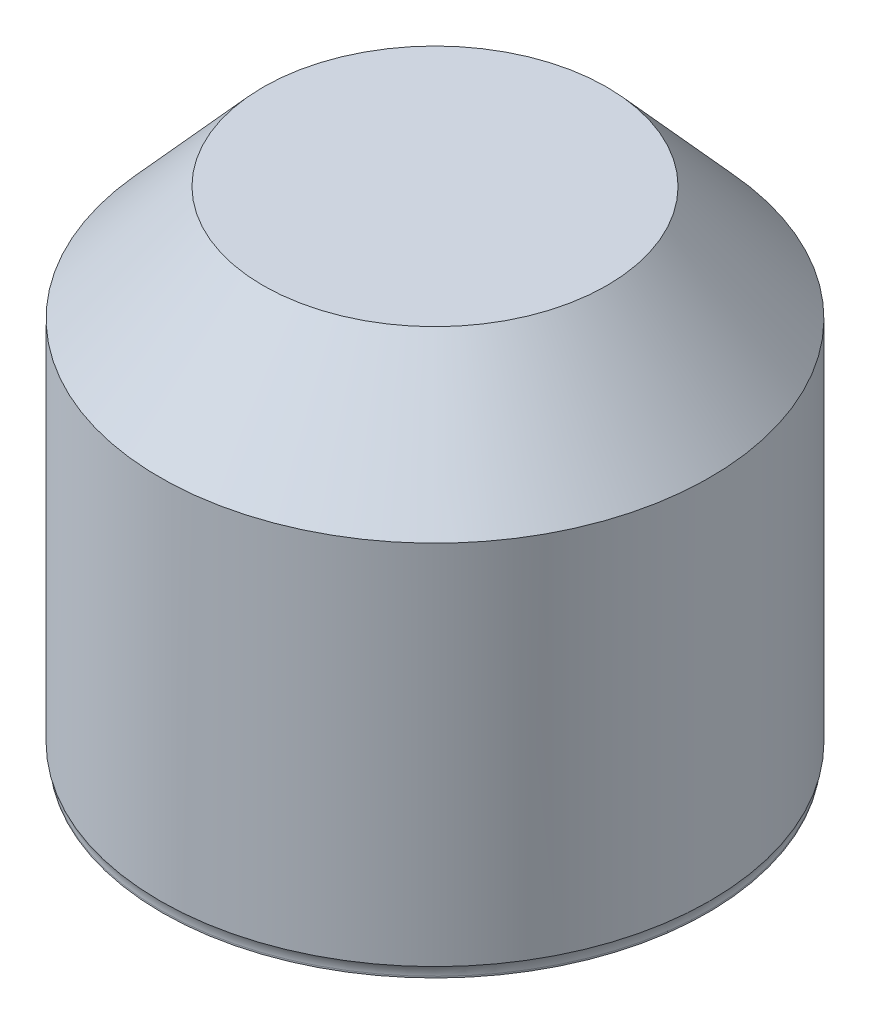
ISO-10303-21;
HEADER;
FILE_DESCRIPTION(('STEP AP214'),'2;1');
FILE_NAME('part.step','',(''),(''),'','','');
FILE_SCHEMA(('AUTOMOTIVE_DESIGN { 1 0 10303 214 1 1 1 1 }'));
ENDSEC;
DATA;
#1=APPLICATION_CONTEXT('core data for automotive mechanical design processes');
#2=APPLICATION_PROTOCOL_DEFINITION('international standard','automotive_design',2000,#1);
#3=PRODUCT_CONTEXT('',#1,'mechanical');
#4=PRODUCT('Part','Part','',(#3));
#5=PRODUCT_RELATED_PRODUCT_CATEGORY('part','',(#4));
#6=PRODUCT_DEFINITION_FORMATION('','',#4);
#7=PRODUCT_DEFINITION_CONTEXT('part definition',#1,'design');
#8=PRODUCT_DEFINITION('design','',#6,#7);
#9=PRODUCT_DEFINITION_SHAPE('','',#8);
#10=(LENGTH_UNIT() NAMED_UNIT(*) SI_UNIT(.MILLI.,.METRE.));
#11=(NAMED_UNIT(*) PLANE_ANGLE_UNIT() SI_UNIT($,.RADIAN.));
#12=(NAMED_UNIT(*) SI_UNIT($,.STERADIAN.) SOLID_ANGLE_UNIT());
#13=UNCERTAINTY_MEASURE_WITH_UNIT(LENGTH_MEASURE(1.E-05),#10,'distance_accuracy_value','');
#14=(GEOMETRIC_REPRESENTATION_CONTEXT(3) GLOBAL_UNCERTAINTY_ASSIGNED_CONTEXT((#13)) GLOBAL_UNIT_ASSIGNED_CONTEXT((#10,
#11,#12)) REPRESENTATION_CONTEXT('',''));
#15=CARTESIAN_POINT('',(0.,0.,0.));
#16=DIRECTION('',(0.,0.,1.));
#17=DIRECTION('',(1.,0.,0.));
#18=AXIS2_PLACEMENT_3D('',#15,#16,#17);
#19=CARTESIAN_POINT('',(0.,0.,0.));
#20=DIRECTION('',(0.,1.,0.));
#21=DIRECTION('',(0.,0.,1.));
#22=AXIS2_PLACEMENT_3D('',#19,#20,#21);
#23=PLANE('',#22);
#24=CARTESIAN_POINT('',(0.,0.,0.));
#25=DIRECTION('',(0.,1.,0.));
#26=DIRECTION('',(0.,0.,1.));
#27=AXIS2_PLACEMENT_3D('',#24,#25,#26);
#28=CIRCLE('',#27,59.5);
#29=CARTESIAN_POINT('',(0.,0.,59.5));
#30=VERTEX_POINT('',#29);
#31=EDGE_CURVE('E71',#30,#30,#28,.T.);
#32=ORIENTED_EDGE('',*,*,#31,.F.);
#33=EDGE_LOOP('',(#32));
#34=FACE_BOUND('',#33,.T.);
#35=CARTESIAN_POINT('',(0.,0.,0.));
#36=DIRECTION('',(0.,1.,0.));
#37=DIRECTION('',(0.,0.,1.));
#38=AXIS2_PLACEMENT_3D('',#35,#36,#37);
#39=CIRCLE('',#38,52.);
#40=CARTESIAN_POINT('',(0.,0.,52.));
#41=VERTEX_POINT('',#40);
#42=EDGE_CURVE('E74',#41,#41,#39,.T.);
#43=ORIENTED_EDGE('',*,*,#42,.T.);
#44=EDGE_LOOP('',(#43));
#45=FACE_BOUND('',#44,.T.);
#46=ADVANCED_FACE('F41',(#34,#45),#23,.F.);
#47=CARTESIAN_POINT('',(0.,2.5,0.));
#48=DIRECTION('',(0.,-1.,0.));
#49=DIRECTION('',(0.,0.,-1.));
#50=AXIS2_PLACEMENT_3D('',#47,#48,#49);
#51=CYLINDRICAL_SURFACE('',#50,59.5);
#52=CARTESIAN_POINT('',(0.,0.320550528229659,0.));
#53=DIRECTION('',(0.,1.,0.));
#54=DIRECTION('',(0.,0.,1.));
#55=AXIS2_PLACEMENT_3D('',#52,#53,#54);
#56=CIRCLE('',#55,59.5);
#57=CARTESIAN_POINT('',(0.,0.320550528229659,59.5));
#58=VERTEX_POINT('',#57);
#59=EDGE_CURVE('E11',#58,#58,#56,.F.);
#60=ORIENTED_EDGE('',*,*,#59,.T.);
#61=EDGE_LOOP('',(#60));
#62=FACE_BOUND('',#61,.T.);
#63=ORIENTED_EDGE('',*,*,#31,.T.);
#64=EDGE_LOOP('',(#63));
#65=FACE_BOUND('',#64,.T.);
#66=ADVANCED_FACE('F136',(#62,#65),#51,.T.);
#67=CARTESIAN_POINT('',(0.,2.5,0.));
#68=DIRECTION('',(0.,-1.,0.));
#69=DIRECTION('',(0.,0.,-1.));
#70=AXIS2_PLACEMENT_3D('',#67,#68,#69);
#71=CYLINDRICAL_SURFACE('',#70,52.);
#72=CARTESIAN_POINT('',(0.,2.5,0.));
#73=DIRECTION('',(0.,1.,0.));
#74=DIRECTION('',(0.,0.,1.));
#75=AXIS2_PLACEMENT_3D('',#72,#73,#74);
#76=CIRCLE('',#75,52.);
#77=CARTESIAN_POINT('',(0.,2.5,52.));
#78=VERTEX_POINT('',#77);
#79=EDGE_CURVE('E77',#78,#78,#76,.T.);
#80=ORIENTED_EDGE('',*,*,#79,.T.);
#81=EDGE_LOOP('',(#80));
#82=FACE_BOUND('',#81,.T.);
#83=ORIENTED_EDGE('',*,*,#42,.F.);
#84=EDGE_LOOP('',(#83));
#85=FACE_BOUND('',#84,.T.);
#86=ADVANCED_FACE('F129',(#82,#85),#71,.F.);
#87=CARTESIAN_POINT('',(0.,2.5,0.));
#88=DIRECTION('',(0.,1.,0.));
#89=DIRECTION('',(0.,0.,1.));
#90=AXIS2_PLACEMENT_3D('',#87,#88,#89);
#91=PLANE('',#90);
#92=CARTESIAN_POINT('',(0.,2.5,0.));
#93=DIRECTION('',(0.,1.,0.));
#94=DIRECTION('',(0.,0.,1.));
#95=AXIS2_PLACEMENT_3D('',#92,#93,#94);
#96=CIRCLE('',#95,47.365);
#97=CARTESIAN_POINT('',(0.,2.5,47.365));
#98=VERTEX_POINT('',#97);
#99=EDGE_CURVE('E68',#98,#98,#96,.T.);
#100=ORIENTED_EDGE('',*,*,#99,.T.);
#101=EDGE_LOOP('',(#100));
#102=FACE_BOUND('',#101,.T.);
#103=ORIENTED_EDGE('',*,*,#79,.F.);
#104=EDGE_LOOP('',(#103));
#105=FACE_BOUND('',#104,.T.);
#106=ADVANCED_FACE('F126',(#102,#105),#91,.F.);
#107=CARTESIAN_POINT('',(0.,72.5,0.));
#108=DIRECTION('',(0.,-1.,0.));
#109=DIRECTION('',(0.,0.,-1.));
#110=AXIS2_PLACEMENT_3D('',#107,#108,#109);
#111=CYLINDRICAL_SURFACE('',#110,60.);
#112=CARTESIAN_POINT('',(0.,2.5,0.));
#113=DIRECTION('',(0.,1.,0.));
#114=DIRECTION('',(0.,0.,1.));
#115=AXIS2_PLACEMENT_3D('',#112,#113,#114);
#116=CIRCLE('',#115,60.);
#117=CARTESIAN_POINT('',(0.,2.5,60.));
#118=VERTEX_POINT('',#117);
#119=EDGE_CURVE('E64',#118,#118,#116,.T.);
#120=ORIENTED_EDGE('',*,*,#119,.T.);
#121=EDGE_LOOP('',(#120));
#122=FACE_BOUND('',#121,.T.);
#123=CARTESIAN_POINT('',(0.,82.5,0.));
#124=DIRECTION('',(0.,-1.,0.));
#125=DIRECTION('',(0.,0.,-1.));
#126=AXIS2_PLACEMENT_3D('',#123,#124,#125);
#127=CIRCLE('',#126,60.);
#128=CARTESIAN_POINT('',(0.,82.5,-60.));
#129=VERTEX_POINT('',#128);
#130=EDGE_CURVE('E61',#129,#129,#127,.F.);
#131=ORIENTED_EDGE('',*,*,#130,.F.);
#132=EDGE_LOOP('',(#131));
#133=FACE_BOUND('',#132,.T.);
#134=ADVANCED_FACE('F124',(#122,#133),#111,.T.);
#135=CARTESIAN_POINT('',(0.,72.5,0.));
#136=DIRECTION('',(0.,-1.,0.));
#137=DIRECTION('',(0.,0.,-1.));
#138=AXIS2_PLACEMENT_3D('',#135,#136,#137);
#139=CYLINDRICAL_SURFACE('',#138,46.365);
#140=CARTESIAN_POINT('',(0.,67.5,0.));
#141=DIRECTION('',(0.,1.,0.));
#142=DIRECTION('',(0.,0.,1.));
#143=AXIS2_PLACEMENT_3D('',#140,#141,#142);
#144=CIRCLE('',#143,46.365);
#145=CARTESIAN_POINT('',(0.,67.5,46.365));
#146=VERTEX_POINT('',#145);
#147=EDGE_CURVE('E52',#146,#146,#144,.T.);
#148=ORIENTED_EDGE('',*,*,#147,.T.);
#149=EDGE_LOOP('',(#148));
#150=FACE_BOUND('',#149,.T.);
#151=CARTESIAN_POINT('',(0.,3.5,0.));
#152=DIRECTION('',(0.,1.,0.));
#153=DIRECTION('',(0.,0.,1.));
#154=AXIS2_PLACEMENT_3D('',#151,#152,#153);
#155=CIRCLE('',#154,46.365);
#156=CARTESIAN_POINT('',(0.,3.5,46.365));
#157=VERTEX_POINT('',#156);
#158=EDGE_CURVE('E56',#157,#157,#155,.F.);
#159=ORIENTED_EDGE('',*,*,#158,.T.);
#160=EDGE_LOOP('',(#159));
#161=FACE_BOUND('',#160,.T.);
#162=ADVANCED_FACE('F121',(#150,#161),#139,.F.);
#163=CARTESIAN_POINT('',(0.,72.5,0.));
#164=DIRECTION('',(0.,1.,0.));
#165=DIRECTION('',(0.,0.,1.));
#166=AXIS2_PLACEMENT_3D('',#163,#164,#165);
#167=PLANE('',#166);
#168=CARTESIAN_POINT('',(0.,72.5,0.));
#169=DIRECTION('',(0.,1.,0.));
#170=DIRECTION('',(0.,0.,1.));
#171=AXIS2_PLACEMENT_3D('',#168,#169,#170);
#172=CIRCLE('',#171,41.365);
#173=CARTESIAN_POINT('',(0.,72.5,41.365));
#174=VERTEX_POINT('',#173);
#175=EDGE_CURVE('E48',#174,#174,#172,.F.);
#176=ORIENTED_EDGE('',*,*,#175,.T.);
#177=EDGE_LOOP('',(#176));
#178=FACE_BOUND('',#177,.T.);
#179=ADVANCED_FACE('F108',(#178),#167,.F.);
#180=CARTESIAN_POINT('',(0.,3.5,0.));
#181=DIRECTION('',(0.,1.,0.));
#182=DIRECTION('',(0.,0.,1.));
#183=AXIS2_PLACEMENT_3D('',#180,#181,#182);
#184=TOROIDAL_SURFACE('',#183,47.365,1.);
#185=ORIENTED_EDGE('',*,*,#158,.F.);
#186=EDGE_LOOP('',(#185));
#187=FACE_BOUND('',#186,.T.);
#188=ORIENTED_EDGE('',*,*,#99,.F.);
#189=EDGE_LOOP('',(#188));
#190=FACE_BOUND('',#189,.T.);
#191=ADVANCED_FACE('F101',(#187,#190),#184,.T.);
#192=CARTESIAN_POINT('',(0.,107.5,0.));
#193=DIRECTION('',(0.,1.,0.));
#194=DIRECTION('',(0.,0.,1.));
#195=AXIS2_PLACEMENT_3D('',#192,#193,#194);
#196=PLANE('',#195);
#197=CARTESIAN_POINT('',(0.,107.5,0.));
#198=DIRECTION('',(0.,1.,0.));
#199=DIRECTION('',(0.,0.,1.));
#200=AXIS2_PLACEMENT_3D('',#197,#198,#199);
#201=CIRCLE('',#200,37.5);
#202=CARTESIAN_POINT('',(0.,107.5,37.5));
#203=VERTEX_POINT('',#202);
#204=EDGE_CURVE('E65',#203,#203,#201,.T.);
#205=ORIENTED_EDGE('',*,*,#204,.T.);
#206=EDGE_LOOP('',(#205));
#207=FACE_BOUND('',#206,.T.);
#208=ADVANCED_FACE('F91',(#207),#196,.T.);
#209=CARTESIAN_POINT('',(0.,107.5,0.));
#210=DIRECTION('',(0.,-1.,0.));
#211=DIRECTION('',(0.,0.,-1.));
#212=AXIS2_PLACEMENT_3D('',#209,#210,#211);
#213=CONICAL_SURFACE('',#212,37.5,0.732815101786506);
#214=ORIENTED_EDGE('',*,*,#130,.T.);
#215=EDGE_LOOP('',(#214));
#216=FACE_BOUND('',#215,.T.);
#217=ORIENTED_EDGE('',*,*,#204,.F.);
#218=EDGE_LOOP('',(#217));
#219=FACE_BOUND('',#218,.T.);
#220=ADVANCED_FACE('F100',(#216,#219),#213,.T.);
#221=CARTESIAN_POINT('',(0.,67.5,0.));
#222=DIRECTION('',(0.,1.,0.));
#223=DIRECTION('',(0.,0.,1.));
#224=AXIS2_PLACEMENT_3D('',#221,#222,#223);
#225=TOROIDAL_SURFACE('',#224,41.365,5.);
#226=ORIENTED_EDGE('',*,*,#175,.F.);
#227=EDGE_LOOP('',(#226));
#228=FACE_BOUND('',#227,.T.);
#229=ORIENTED_EDGE('',*,*,#147,.F.);
#230=EDGE_LOOP('',(#229));
#231=FACE_BOUND('',#230,.T.);
#232=ADVANCED_FACE('F106',(#228,#231),#225,.F.);
#233=CARTESIAN_POINT('',(0.,0.320550528229659,0.));
#234=DIRECTION('',(0.,1.,0.));
#235=DIRECTION('',(0.,0.,1.));
#236=AXIS2_PLACEMENT_3D('',#233,#234,#235);
#237=TOROIDAL_SURFACE('',#236,64.5,5.);
#238=ORIENTED_EDGE('',*,*,#59,.F.);
#239=EDGE_LOOP('',(#238));
#240=FACE_BOUND('',#239,.T.);
#241=ORIENTED_EDGE('',*,*,#119,.F.);
#242=EDGE_LOOP('',(#241));
#243=FACE_BOUND('',#242,.T.);
#244=ADVANCED_FACE('F43',(#240,#243),#237,.F.);
#245=CLOSED_SHELL('',(#46,#66,#86,#106,#134,#162,#179,#191,#208,#220,#232,#244));
#246=MANIFOLD_SOLID_BREP('B2',#245);
#247=ADVANCED_BREP_SHAPE_REPRESENTATION('',(#18,#246),#14);
#248=SHAPE_DEFINITION_REPRESENTATION(#9,#247);
ENDSEC;
END-ISO-10303-21;
